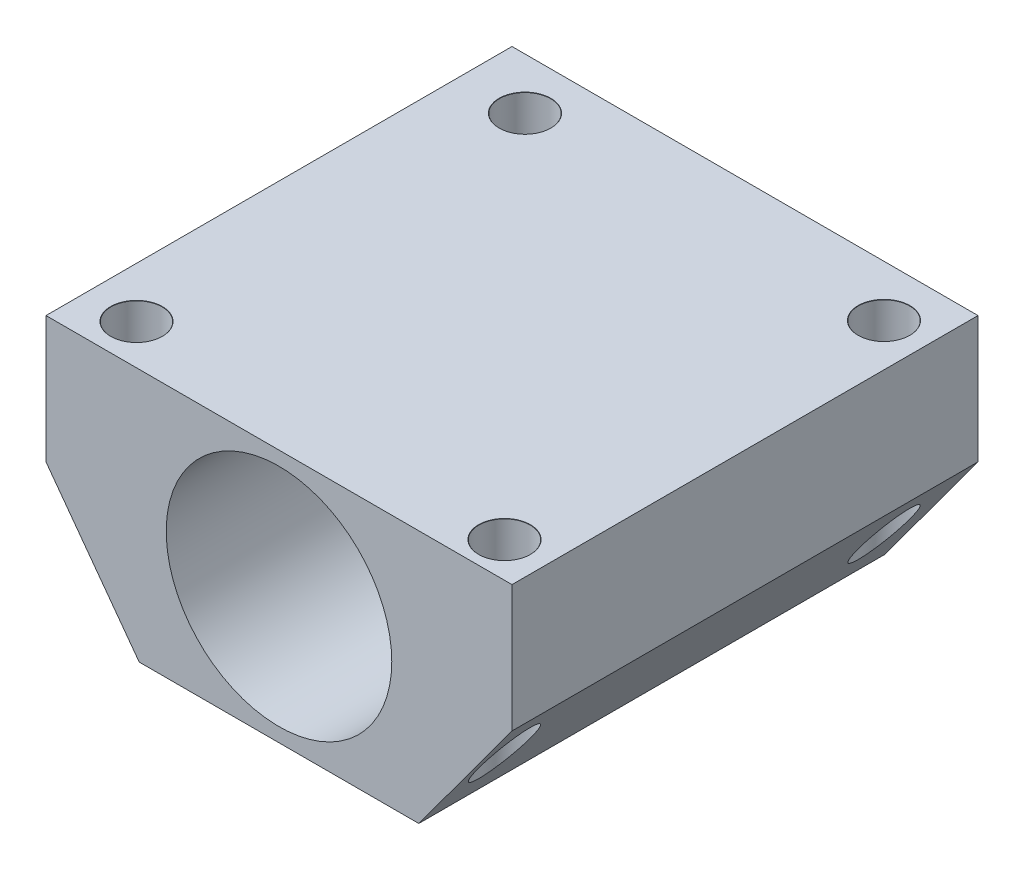
ISO-10303-21;
HEADER;
FILE_DESCRIPTION(('STEP AP214'),'2;1');
FILE_NAME('part.step','',(''),(''),'','','');
FILE_SCHEMA(('AUTOMOTIVE_DESIGN { 1 0 10303 214 1 1 1 1 }'));
ENDSEC;
DATA;
#1=APPLICATION_CONTEXT('core data for automotive mechanical design processes');
#2=APPLICATION_PROTOCOL_DEFINITION('international standard','automotive_design',2000,#1);
#3=PRODUCT_CONTEXT('',#1,'mechanical');
#4=PRODUCT('Part','Part','',(#3));
#5=PRODUCT_RELATED_PRODUCT_CATEGORY('part','',(#4));
#6=PRODUCT_DEFINITION_FORMATION('','',#4);
#7=PRODUCT_DEFINITION_CONTEXT('part definition',#1,'design');
#8=PRODUCT_DEFINITION('design','',#6,#7);
#9=PRODUCT_DEFINITION_SHAPE('','',#8);
#10=(LENGTH_UNIT() NAMED_UNIT(*) SI_UNIT(.MILLI.,.METRE.));
#11=(NAMED_UNIT(*) PLANE_ANGLE_UNIT() SI_UNIT($,.RADIAN.));
#12=(NAMED_UNIT(*) SI_UNIT($,.STERADIAN.) SOLID_ANGLE_UNIT());
#13=UNCERTAINTY_MEASURE_WITH_UNIT(LENGTH_MEASURE(1.E-05),#10,'distance_accuracy_value','');
#14=(GEOMETRIC_REPRESENTATION_CONTEXT(3) GLOBAL_UNCERTAINTY_ASSIGNED_CONTEXT((#13)) GLOBAL_UNIT_ASSIGNED_CONTEXT((#10,
#11,#12)) REPRESENTATION_CONTEXT('',''));
#15=CARTESIAN_POINT('',(0.,0.,0.));
#16=DIRECTION('',(0.,0.,1.));
#17=DIRECTION('',(1.,0.,0.));
#18=AXIS2_PLACEMENT_3D('',#15,#16,#17);
#19=CARTESIAN_POINT('',(0.,13.6,50.));
#20=DIRECTION('',(0.,1.,0.));
#21=DIRECTION('',(0.,0.,1.));
#22=AXIS2_PLACEMENT_3D('',#19,#20,#21);
#23=PLANE('',#22);
#24=CARTESIAN_POINT('',(-18.1068628243473,13.6,5.50030157377977));
#25=DIRECTION('',(0.,1.,0.));
#26=DIRECTION('',(0.,0.,1.));
#27=AXIS2_PLACEMENT_3D('',#24,#25,#26);
#28=CIRCLE('',#27,2.775);
#29=CARTESIAN_POINT('',(-18.1068628243473,13.6,8.27530157377977));
#30=VERTEX_POINT('',#29);
#31=EDGE_CURVE('E196',#30,#30,#28,.T.);
#32=ORIENTED_EDGE('',*,*,#31,.F.);
#33=EDGE_LOOP('',(#32));
#34=FACE_BOUND('',#33,.T.);
#35=CARTESIAN_POINT('',(-19.5970381536998,13.6,45.69277847704));
#36=DIRECTION('',(0.,1.,0.));
#37=DIRECTION('',(0.,0.,1.));
#38=AXIS2_PLACEMENT_3D('',#35,#36,#37);
#39=CIRCLE('',#38,2.775);
#40=CARTESIAN_POINT('',(-19.5970381536998,13.6,48.46777847704));
#41=VERTEX_POINT('',#40);
#42=EDGE_CURVE('E168',#41,#41,#39,.T.);
#43=ORIENTED_EDGE('',*,*,#42,.F.);
#44=EDGE_LOOP('',(#43));
#45=FACE_BOUND('',#44,.T.);
#46=CARTESIAN_POINT('',(20.4123961402374,13.6,46.215787070027));
#47=DIRECTION('',(0.,1.,0.));
#48=DIRECTION('',(0.,0.,1.));
#49=AXIS2_PLACEMENT_3D('',#46,#47,#48);
#50=CIRCLE('',#49,2.775);
#51=CARTESIAN_POINT('',(20.4123961402374,13.6,48.990787070027));
#52=VERTEX_POINT('',#51);
#53=EDGE_CURVE('E161',#52,#52,#50,.T.);
#54=ORIENTED_EDGE('',*,*,#53,.F.);
#55=EDGE_LOOP('',(#54));
#56=FACE_BOUND('',#55,.T.);
#57=CARTESIAN_POINT('',(20.4123961402374,13.6,5.50030157377977));
#58=DIRECTION('',(0.,1.,0.));
#59=DIRECTION('',(0.,0.,1.));
#60=AXIS2_PLACEMENT_3D('',#57,#58,#59);
#61=CIRCLE('',#60,2.775);
#62=CARTESIAN_POINT('',(20.4123961402374,13.6,8.27530157377977));
#63=VERTEX_POINT('',#62);
#64=EDGE_CURVE('E157',#63,#63,#61,.T.);
#65=ORIENTED_EDGE('',*,*,#64,.F.);
#66=EDGE_LOOP('',(#65));
#67=FACE_BOUND('',#66,.T.);
#68=DIRECTION('',(1.,0.,0.));
#69=VECTOR('',#68,1.);
#70=CARTESIAN_POINT('',(0.,13.6,0.));
#71=LINE('',#70,#69);
#72=CARTESIAN_POINT('',(-25.,13.6,0.));
#73=VERTEX_POINT('',#72);
#74=CARTESIAN_POINT('',(25.,13.6,0.));
#75=VERTEX_POINT('',#74);
#76=EDGE_CURVE('E129',#73,#75,#71,.T.);
#77=ORIENTED_EDGE('',*,*,#76,.F.);
#78=DIRECTION('',(0.,0.,-1.));
#79=VECTOR('',#78,1.);
#80=CARTESIAN_POINT('',(-25.,13.6,50.));
#81=LINE('',#80,#79);
#82=CARTESIAN_POINT('',(-25.,13.6,50.));
#83=VERTEX_POINT('',#82);
#84=EDGE_CURVE('E11',#83,#73,#81,.T.);
#85=ORIENTED_EDGE('',*,*,#84,.F.);
#86=DIRECTION('',(1.,0.,0.));
#87=VECTOR('',#86,1.);
#88=CARTESIAN_POINT('',(0.,13.6,50.));
#89=LINE('',#88,#87);
#90=CARTESIAN_POINT('',(25.,13.6,50.));
#91=VERTEX_POINT('',#90);
#92=EDGE_CURVE('E147',#83,#91,#89,.T.);
#93=ORIENTED_EDGE('',*,*,#92,.T.);
#94=DIRECTION('',(0.,0.,-1.));
#95=VECTOR('',#94,1.);
#96=CARTESIAN_POINT('',(25.,13.6,50.));
#97=LINE('',#96,#95);
#98=EDGE_CURVE('E58',#91,#75,#97,.T.);
#99=ORIENTED_EDGE('',*,*,#98,.T.);
#100=EDGE_LOOP('',(#77,#85,#93,#99));
#101=FACE_BOUND('',#100,.T.);
#102=ADVANCED_FACE('F40',(#34,#45,#56,#67,#101),#23,.T.);
#103=CARTESIAN_POINT('',(-25.,0.,50.));
#104=DIRECTION('',(-1.,0.,0.));
#105=DIRECTION('',(0.,0.,1.));
#106=AXIS2_PLACEMENT_3D('',#103,#104,#105);
#107=PLANE('',#106);
#108=DIRECTION('',(0.,1.,0.));
#109=VECTOR('',#108,1.);
#110=CARTESIAN_POINT('',(-25.,0.,0.));
#111=LINE('',#110,#109);
#112=CARTESIAN_POINT('',(-25.,0.,0.));
#113=VERTEX_POINT('',#112);
#114=EDGE_CURVE('E131',#113,#73,#111,.T.);
#115=ORIENTED_EDGE('',*,*,#114,.F.);
#116=DIRECTION('',(0.,0.,-1.));
#117=VECTOR('',#116,1.);
#118=CARTESIAN_POINT('',(-25.,0.,50.));
#119=LINE('',#118,#117);
#120=CARTESIAN_POINT('',(-25.,0.,50.));
#121=VERTEX_POINT('',#120);
#122=EDGE_CURVE('E49',#121,#113,#119,.T.);
#123=ORIENTED_EDGE('',*,*,#122,.F.);
#124=DIRECTION('',(0.,1.,0.));
#125=VECTOR('',#124,1.);
#126=CARTESIAN_POINT('',(-25.,0.,50.));
#127=LINE('',#126,#125);
#128=EDGE_CURVE('E121',#121,#83,#127,.T.);
#129=ORIENTED_EDGE('',*,*,#128,.T.);
#130=ORIENTED_EDGE('',*,*,#84,.T.);
#131=EDGE_LOOP('',(#115,#123,#129,#130));
#132=FACE_BOUND('',#131,.T.);
#133=ADVANCED_FACE('F185',(#132),#107,.T.);
#134=CARTESIAN_POINT('',(-16.2268388545761,-11.9314991577765,50.));
#135=DIRECTION('',(0.805651012649425,0.592390450477518,0.));
#136=DIRECTION('',(-0.592390450477518,0.805651012649425,0.));
#137=AXIS2_PLACEMENT_3D('',#134,#135,#136);
#138=PLANE('',#137);
#139=CARTESIAN_POINT('',(-18.1068628243473,-9.37466655888772,5.50030157377977));
#140=DIRECTION('',(0.805651012649425,0.592390450477518,0.));
#141=DIRECTION('',(-0.592390450477518,0.805651012649425,0.));
#142=AXIS2_PLACEMENT_3D('',#139,#140,#141);
#143=ELLIPSE('',#142,4.64220852612201,2.74999999999999);
#144=CARTESIAN_POINT('',(-20.8568628243473,-5.63466655888773,5.50030157377977));
#145=VERTEX_POINT('',#144);
#146=EDGE_CURVE('E43',#145,#145,#143,.T.);
#147=ORIENTED_EDGE('',*,*,#146,.T.);
#148=EDGE_LOOP('',(#147));
#149=FACE_BOUND('',#148,.T.);
#150=CARTESIAN_POINT('',(-19.5970381536998,-7.34802811096822,45.69277847704));
#151=DIRECTION('',(0.805651012649425,0.592390450477518,0.));
#152=DIRECTION('',(-0.592390450477518,0.805651012649425,0.));
#153=AXIS2_PLACEMENT_3D('',#150,#151,#152);
#154=ELLIPSE('',#153,4.64220852612201,2.74999999999999);
#155=CARTESIAN_POINT('',(-22.3470381536998,-3.60802811096823,45.69277847704));
#156=VERTEX_POINT('',#155);
#157=EDGE_CURVE('E159',#156,#156,#154,.T.);
#158=ORIENTED_EDGE('',*,*,#157,.T.);
#159=EDGE_LOOP('',(#158));
#160=FACE_BOUND('',#159,.T.);
#161=DIRECTION('',(0.592390450477518,-0.805651012649425,0.));
#162=VECTOR('',#161,1.);
#163=CARTESIAN_POINT('',(-16.2268388545761,-11.9314991577765,0.));
#164=LINE('',#163,#162);
#165=CARTESIAN_POINT('',(-15.,-13.6,0.));
#166=VERTEX_POINT('',#165);
#167=EDGE_CURVE('E135',#113,#166,#164,.T.);
#168=ORIENTED_EDGE('',*,*,#167,.T.);
#169=DIRECTION('',(0.,0.,-1.));
#170=VECTOR('',#169,1.);
#171=CARTESIAN_POINT('',(-15.,-13.6,50.));
#172=LINE('',#171,#170);
#173=CARTESIAN_POINT('',(-15.,-13.6,50.));
#174=VERTEX_POINT('',#173);
#175=EDGE_CURVE('E106',#174,#166,#172,.T.);
#176=ORIENTED_EDGE('',*,*,#175,.F.);
#177=DIRECTION('',(0.592390450477518,-0.805651012649425,0.));
#178=VECTOR('',#177,1.);
#179=CARTESIAN_POINT('',(-16.2268388545761,-11.9314991577765,50.));
#180=LINE('',#179,#178);
#181=EDGE_CURVE('E118',#121,#174,#180,.T.);
#182=ORIENTED_EDGE('',*,*,#181,.F.);
#183=ORIENTED_EDGE('',*,*,#122,.T.);
#184=EDGE_LOOP('',(#168,#176,#182,#183));
#185=FACE_BOUND('',#184,.T.);
#186=ADVANCED_FACE('F192',(#149,#160,#185),#138,.F.);
#187=CARTESIAN_POINT('',(0.,-13.6,50.));
#188=DIRECTION('',(0.,-1.,0.));
#189=DIRECTION('',(1.,0.,0.));
#190=AXIS2_PLACEMENT_3D('',#187,#188,#189);
#191=PLANE('',#190);
#192=DIRECTION('',(-1.,0.,0.));
#193=VECTOR('',#192,1.);
#194=CARTESIAN_POINT('',(0.,-13.6,0.));
#195=LINE('',#194,#193);
#196=CARTESIAN_POINT('',(15.,-13.6,0.));
#197=VERTEX_POINT('',#196);
#198=EDGE_CURVE('E103',#197,#166,#195,.T.);
#199=ORIENTED_EDGE('',*,*,#198,.F.);
#200=DIRECTION('',(0.,0.,-1.));
#201=VECTOR('',#200,1.);
#202=CARTESIAN_POINT('',(15.,-13.6,50.));
#203=LINE('',#202,#201);
#204=CARTESIAN_POINT('',(15.,-13.6,50.));
#205=VERTEX_POINT('',#204);
#206=EDGE_CURVE('E97',#205,#197,#203,.T.);
#207=ORIENTED_EDGE('',*,*,#206,.F.);
#208=DIRECTION('',(-1.,0.,0.));
#209=VECTOR('',#208,1.);
#210=CARTESIAN_POINT('',(0.,-13.6,50.));
#211=LINE('',#210,#209);
#212=EDGE_CURVE('E101',#205,#174,#211,.T.);
#213=ORIENTED_EDGE('',*,*,#212,.T.);
#214=ORIENTED_EDGE('',*,*,#175,.T.);
#215=EDGE_LOOP('',(#199,#207,#213,#214));
#216=FACE_BOUND('',#215,.T.);
#217=ADVANCED_FACE('F99',(#216),#191,.T.);
#218=CARTESIAN_POINT('',(16.2268388545761,-11.9314991577765,50.));
#219=DIRECTION('',(-0.805651012649425,0.592390450477518,0.));
#220=DIRECTION('',(-0.592390450477518,-0.805651012649425,0.));
#221=AXIS2_PLACEMENT_3D('',#218,#219,#220);
#222=PLANE('',#221);
#223=CARTESIAN_POINT('',(20.4123961402374,-6.23914124927717,46.215787070027));
#224=DIRECTION('',(-0.805651012649425,0.592390450477518,0.));
#225=DIRECTION('',(0.592390450477518,0.805651012649425,0.));
#226=AXIS2_PLACEMENT_3D('',#223,#224,#225);
#227=ELLIPSE('',#226,4.64220852612201,2.74999999999999);
#228=CARTESIAN_POINT('',(23.1623961402374,-2.49914124927718,46.215787070027));
#229=VERTEX_POINT('',#228);
#230=EDGE_CURVE('E155',#229,#229,#227,.T.);
#231=ORIENTED_EDGE('',*,*,#230,.T.);
#232=EDGE_LOOP('',(#231));
#233=FACE_BOUND('',#232,.T.);
#234=CARTESIAN_POINT('',(20.4123961402374,-6.23914124927717,5.50030157377977));
#235=DIRECTION('',(-0.805651012649425,0.592390450477518,0.));
#236=DIRECTION('',(0.592390450477518,0.805651012649425,0.));
#237=AXIS2_PLACEMENT_3D('',#234,#235,#236);
#238=ELLIPSE('',#237,4.64220852612201,2.74999999999999);
#239=CARTESIAN_POINT('',(23.1623961402374,-2.49914124927718,5.50030157377977));
#240=VERTEX_POINT('',#239);
#241=EDGE_CURVE('E132',#240,#240,#238,.T.);
#242=ORIENTED_EDGE('',*,*,#241,.T.);
#243=EDGE_LOOP('',(#242));
#244=FACE_BOUND('',#243,.T.);
#245=DIRECTION('',(0.592390450477518,0.805651012649425,0.));
#246=VECTOR('',#245,1.);
#247=CARTESIAN_POINT('',(16.2268388545761,-11.9314991577765,0.));
#248=LINE('',#247,#246);
#249=CARTESIAN_POINT('',(25.,0.,0.));
#250=VERTEX_POINT('',#249);
#251=EDGE_CURVE('E139',#197,#250,#248,.T.);
#252=ORIENTED_EDGE('',*,*,#251,.T.);
#253=DIRECTION('',(0.,0.,-1.));
#254=VECTOR('',#253,1.);
#255=CARTESIAN_POINT('',(25.,0.,50.));
#256=LINE('',#255,#254);
#257=CARTESIAN_POINT('',(25.,0.,50.));
#258=VERTEX_POINT('',#257);
#259=EDGE_CURVE('E78',#258,#250,#256,.T.);
#260=ORIENTED_EDGE('',*,*,#259,.F.);
#261=DIRECTION('',(0.592390450477518,0.805651012649425,0.));
#262=VECTOR('',#261,1.);
#263=CARTESIAN_POINT('',(16.2268388545761,-11.9314991577765,50.));
#264=LINE('',#263,#262);
#265=EDGE_CURVE('E108',#205,#258,#264,.T.);
#266=ORIENTED_EDGE('',*,*,#265,.F.);
#267=ORIENTED_EDGE('',*,*,#206,.T.);
#268=EDGE_LOOP('',(#252,#260,#266,#267));
#269=FACE_BOUND('',#268,.T.);
#270=ADVANCED_FACE('F109',(#233,#244,#269),#222,.F.);
#271=CARTESIAN_POINT('',(25.,0.,50.));
#272=DIRECTION('',(1.,0.,0.));
#273=DIRECTION('',(0.,0.,-1.));
#274=AXIS2_PLACEMENT_3D('',#271,#272,#273);
#275=PLANE('',#274);
#276=DIRECTION('',(0.,-1.,0.));
#277=VECTOR('',#276,1.);
#278=CARTESIAN_POINT('',(25.,0.,0.));
#279=LINE('',#278,#277);
#280=EDGE_CURVE('E141',#75,#250,#279,.T.);
#281=ORIENTED_EDGE('',*,*,#280,.F.);
#282=ORIENTED_EDGE('',*,*,#98,.F.);
#283=DIRECTION('',(0.,-1.,0.));
#284=VECTOR('',#283,1.);
#285=CARTESIAN_POINT('',(25.,0.,50.));
#286=LINE('',#285,#284);
#287=EDGE_CURVE('E112',#91,#258,#286,.T.);
#288=ORIENTED_EDGE('',*,*,#287,.T.);
#289=ORIENTED_EDGE('',*,*,#259,.T.);
#290=EDGE_LOOP('',(#281,#282,#288,#289));
#291=FACE_BOUND('',#290,.T.);
#292=ADVANCED_FACE('F231',(#291),#275,.T.);
#293=CARTESIAN_POINT('',(0.,0.,50.));
#294=DIRECTION('',(0.,0.,-1.));
#295=DIRECTION('',(-1.,0.,0.));
#296=AXIS2_PLACEMENT_3D('',#293,#294,#295);
#297=CYLINDRICAL_SURFACE('',#296,12.1);
#298=CARTESIAN_POINT('',(0.,0.,50.));
#299=DIRECTION('',(0.,0.,1.));
#300=DIRECTION('',(1.,0.,0.));
#301=AXIS2_PLACEMENT_3D('',#298,#299,#300);
#302=CIRCLE('',#301,12.1);
#303=CARTESIAN_POINT('',(12.1,0.,50.));
#304=VERTEX_POINT('',#303);
#305=EDGE_CURVE('E126',#304,#304,#302,.T.);
#306=ORIENTED_EDGE('',*,*,#305,.T.);
#307=EDGE_LOOP('',(#306));
#308=FACE_BOUND('',#307,.T.);
#309=CARTESIAN_POINT('',(0.,0.,0.));
#310=DIRECTION('',(0.,0.,1.));
#311=DIRECTION('',(1.,0.,0.));
#312=AXIS2_PLACEMENT_3D('',#309,#310,#311);
#313=CIRCLE('',#312,12.1);
#314=CARTESIAN_POINT('',(12.1,0.,0.));
#315=VERTEX_POINT('',#314);
#316=EDGE_CURVE('E144',#315,#315,#313,.T.);
#317=ORIENTED_EDGE('',*,*,#316,.F.);
#318=EDGE_LOOP('',(#317));
#319=FACE_BOUND('',#318,.T.);
#320=ADVANCED_FACE('F225',(#308,#319),#297,.F.);
#321=CARTESIAN_POINT('',(0.,0.,50.));
#322=DIRECTION('',(0.,0.,1.));
#323=DIRECTION('',(1.,0.,0.));
#324=AXIS2_PLACEMENT_3D('',#321,#322,#323);
#325=PLANE('',#324);
#326=ORIENTED_EDGE('',*,*,#92,.F.);
#327=ORIENTED_EDGE('',*,*,#128,.F.);
#328=ORIENTED_EDGE('',*,*,#181,.T.);
#329=ORIENTED_EDGE('',*,*,#212,.F.);
#330=ORIENTED_EDGE('',*,*,#265,.T.);
#331=ORIENTED_EDGE('',*,*,#287,.F.);
#332=EDGE_LOOP('',(#326,#327,#328,#329,#330,#331));
#333=FACE_BOUND('',#332,.T.);
#334=ORIENTED_EDGE('',*,*,#305,.F.);
#335=EDGE_LOOP('',(#334));
#336=FACE_BOUND('',#335,.T.);
#337=ADVANCED_FACE('F114',(#333,#336),#325,.T.);
#338=CARTESIAN_POINT('',(0.,0.,0.));
#339=DIRECTION('',(0.,0.,1.));
#340=DIRECTION('',(1.,0.,0.));
#341=AXIS2_PLACEMENT_3D('',#338,#339,#340);
#342=PLANE('',#341);
#343=ORIENTED_EDGE('',*,*,#76,.T.);
#344=ORIENTED_EDGE('',*,*,#280,.T.);
#345=ORIENTED_EDGE('',*,*,#251,.F.);
#346=ORIENTED_EDGE('',*,*,#198,.T.);
#347=ORIENTED_EDGE('',*,*,#167,.F.);
#348=ORIENTED_EDGE('',*,*,#114,.T.);
#349=EDGE_LOOP('',(#343,#344,#345,#346,#347,#348));
#350=FACE_BOUND('',#349,.T.);
#351=ORIENTED_EDGE('',*,*,#316,.T.);
#352=EDGE_LOOP('',(#351));
#353=FACE_BOUND('',#352,.T.);
#354=ADVANCED_FACE('F217',(#350,#353),#342,.F.);
#355=CARTESIAN_POINT('',(20.4123961402374,13.6,5.50030157377977));
#356=DIRECTION('',(0.,1.,0.));
#357=DIRECTION('',(0.,0.,1.));
#358=AXIS2_PLACEMENT_3D('',#355,#356,#357);
#359=CYLINDRICAL_SURFACE('',#358,2.74999999999999);
#360=CARTESIAN_POINT('',(20.4123961402374,13.575,5.50030157377977));
#361=DIRECTION('',(0.,1.,0.));
#362=DIRECTION('',(0.,0.,1.));
#363=AXIS2_PLACEMENT_3D('',#360,#361,#362);
#364=CIRCLE('',#363,2.74999999999999);
#365=CARTESIAN_POINT('',(20.4123961402374,13.575,8.25030157377976));
#366=VERTEX_POINT('',#365);
#367=EDGE_CURVE('E154',#366,#366,#364,.T.);
#368=ORIENTED_EDGE('',*,*,#367,.T.);
#369=EDGE_LOOP('',(#368));
#370=FACE_BOUND('',#369,.T.);
#371=ORIENTED_EDGE('',*,*,#241,.F.);
#372=EDGE_LOOP('',(#371));
#373=FACE_BOUND('',#372,.T.);
#374=ADVANCED_FACE('F206',(#370,#373),#359,.F.);
#375=CARTESIAN_POINT('',(20.4123961402374,13.6,5.50030157377977));
#376=DIRECTION('',(0.,1.,0.));
#377=DIRECTION('',(0.,0.,1.));
#378=AXIS2_PLACEMENT_3D('',#375,#376,#377);
#379=CONICAL_SURFACE('',#378,2.775,0.785398163397691);
#380=ORIENTED_EDGE('',*,*,#367,.F.);
#381=EDGE_LOOP('',(#380));
#382=FACE_BOUND('',#381,.T.);
#383=ORIENTED_EDGE('',*,*,#64,.T.);
#384=EDGE_LOOP('',(#383));
#385=FACE_BOUND('',#384,.T.);
#386=ADVANCED_FACE('F203',(#382,#385),#379,.F.);
#387=CARTESIAN_POINT('',(20.4123961402374,13.6,46.215787070027));
#388=DIRECTION('',(0.,1.,0.));
#389=DIRECTION('',(0.,0.,1.));
#390=AXIS2_PLACEMENT_3D('',#387,#388,#389);
#391=CYLINDRICAL_SURFACE('',#390,2.74999999999999);
#392=CARTESIAN_POINT('',(20.4123961402374,13.575,46.215787070027));
#393=DIRECTION('',(0.,1.,0.));
#394=DIRECTION('',(0.,0.,1.));
#395=AXIS2_PLACEMENT_3D('',#392,#393,#394);
#396=CIRCLE('',#395,2.74999999999999);
#397=CARTESIAN_POINT('',(20.4123961402374,13.575,48.965787070027));
#398=VERTEX_POINT('',#397);
#399=EDGE_CURVE('E158',#398,#398,#396,.T.);
#400=ORIENTED_EDGE('',*,*,#399,.T.);
#401=EDGE_LOOP('',(#400));
#402=FACE_BOUND('',#401,.T.);
#403=ORIENTED_EDGE('',*,*,#230,.F.);
#404=EDGE_LOOP('',(#403));
#405=FACE_BOUND('',#404,.T.);
#406=ADVANCED_FACE('F205',(#402,#405),#391,.F.);
#407=CARTESIAN_POINT('',(20.4123961402374,13.6,46.215787070027));
#408=DIRECTION('',(0.,1.,0.));
#409=DIRECTION('',(0.,0.,1.));
#410=AXIS2_PLACEMENT_3D('',#407,#408,#409);
#411=CONICAL_SURFACE('',#410,2.775,0.785398163397691);
#412=ORIENTED_EDGE('',*,*,#399,.F.);
#413=EDGE_LOOP('',(#412));
#414=FACE_BOUND('',#413,.T.);
#415=ORIENTED_EDGE('',*,*,#53,.T.);
#416=EDGE_LOOP('',(#415));
#417=FACE_BOUND('',#416,.T.);
#418=ADVANCED_FACE('F214',(#414,#417),#411,.F.);
#419=CARTESIAN_POINT('',(-19.5970381536998,13.6,45.69277847704));
#420=DIRECTION('',(0.,1.,0.));
#421=DIRECTION('',(0.,0.,1.));
#422=AXIS2_PLACEMENT_3D('',#419,#420,#421);
#423=CYLINDRICAL_SURFACE('',#422,2.74999999999999);
#424=CARTESIAN_POINT('',(-19.5970381536998,13.575,45.69277847704));
#425=DIRECTION('',(0.,1.,0.));
#426=DIRECTION('',(0.,0.,1.));
#427=AXIS2_PLACEMENT_3D('',#424,#425,#426);
#428=CIRCLE('',#427,2.74999999999999);
#429=CARTESIAN_POINT('',(-19.5970381536998,13.575,48.44277847704));
#430=VERTEX_POINT('',#429);
#431=EDGE_CURVE('E162',#430,#430,#428,.T.);
#432=ORIENTED_EDGE('',*,*,#431,.T.);
#433=EDGE_LOOP('',(#432));
#434=FACE_BOUND('',#433,.T.);
#435=ORIENTED_EDGE('',*,*,#157,.F.);
#436=EDGE_LOOP('',(#435));
#437=FACE_BOUND('',#436,.T.);
#438=ADVANCED_FACE('F273',(#434,#437),#423,.F.);
#439=CARTESIAN_POINT('',(-19.5970381536998,13.6,45.69277847704));
#440=DIRECTION('',(0.,1.,0.));
#441=DIRECTION('',(0.,0.,1.));
#442=AXIS2_PLACEMENT_3D('',#439,#440,#441);
#443=CONICAL_SURFACE('',#442,2.775,0.785398163397691);
#444=ORIENTED_EDGE('',*,*,#431,.F.);
#445=EDGE_LOOP('',(#444));
#446=FACE_BOUND('',#445,.T.);
#447=ORIENTED_EDGE('',*,*,#42,.T.);
#448=EDGE_LOOP('',(#447));
#449=FACE_BOUND('',#448,.T.);
#450=ADVANCED_FACE('F268',(#446,#449),#443,.F.);
#451=CARTESIAN_POINT('',(-18.1068628243473,13.6,5.50030157377977));
#452=DIRECTION('',(0.,1.,0.));
#453=DIRECTION('',(0.,0.,1.));
#454=AXIS2_PLACEMENT_3D('',#451,#452,#453);
#455=CYLINDRICAL_SURFACE('',#454,2.74999999999999);
#456=CARTESIAN_POINT('',(-18.1068628243473,13.575,5.50030157377977));
#457=DIRECTION('',(0.,1.,0.));
#458=DIRECTION('',(0.,0.,1.));
#459=AXIS2_PLACEMENT_3D('',#456,#457,#458);
#460=CIRCLE('',#459,2.74999999999999);
#461=CARTESIAN_POINT('',(-18.1068628243473,13.575,8.25030157377976));
#462=VERTEX_POINT('',#461);
#463=EDGE_CURVE('E253',#462,#462,#460,.T.);
#464=ORIENTED_EDGE('',*,*,#463,.T.);
#465=EDGE_LOOP('',(#464));
#466=FACE_BOUND('',#465,.T.);
#467=ORIENTED_EDGE('',*,*,#146,.F.);
#468=EDGE_LOOP('',(#467));
#469=FACE_BOUND('',#468,.T.);
#470=ADVANCED_FACE('F261',(#466,#469),#455,.F.);
#471=CARTESIAN_POINT('',(-18.1068628243473,13.6,5.50030157377977));
#472=DIRECTION('',(0.,1.,0.));
#473=DIRECTION('',(0.,0.,1.));
#474=AXIS2_PLACEMENT_3D('',#471,#472,#473);
#475=CONICAL_SURFACE('',#474,2.775,0.785398163397691);
#476=ORIENTED_EDGE('',*,*,#463,.F.);
#477=EDGE_LOOP('',(#476));
#478=FACE_BOUND('',#477,.T.);
#479=ORIENTED_EDGE('',*,*,#31,.T.);
#480=EDGE_LOOP('',(#479));
#481=FACE_BOUND('',#480,.T.);
#482=ADVANCED_FACE('F259',(#478,#481),#475,.F.);
#483=CLOSED_SHELL('',(#102,#133,#186,#217,#270,#292,#320,#337,#354,#374,#386,#406,#418,#438,
#450,#470,#482));
#484=MANIFOLD_SOLID_BREP('B2',#483);
#485=ADVANCED_BREP_SHAPE_REPRESENTATION('',(#18,#484),#14);
#486=SHAPE_DEFINITION_REPRESENTATION(#9,#485);
ENDSEC;
END-ISO-10303-21;
